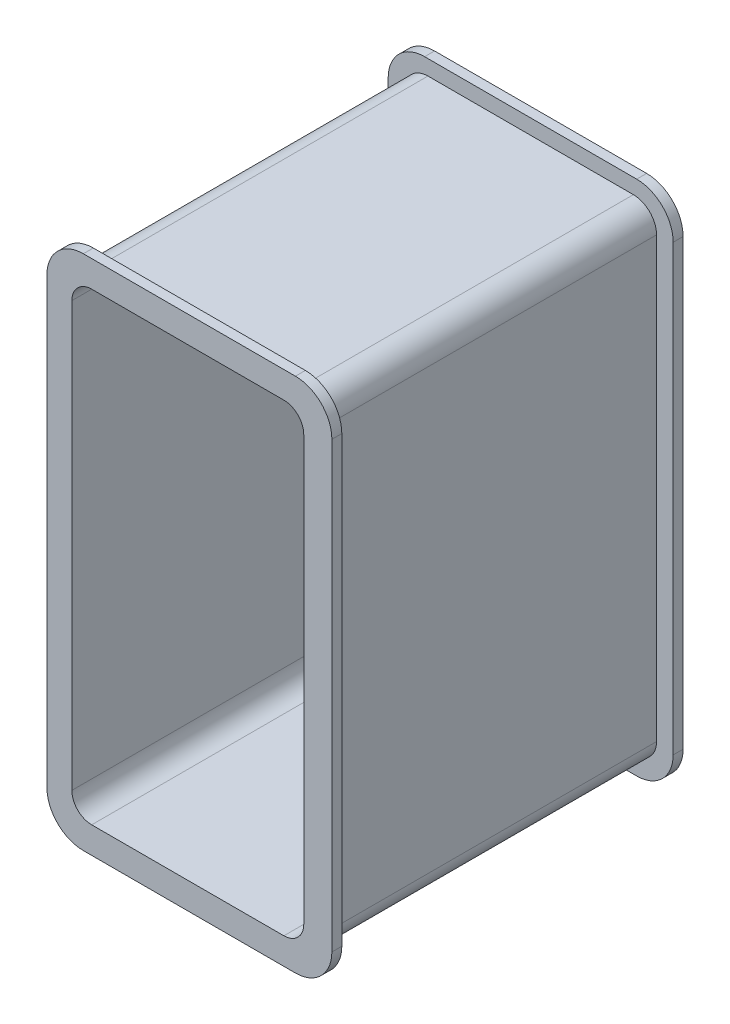
ISO-10303-21;
HEADER;
FILE_DESCRIPTION(('STEP AP214'),'2;1');
FILE_NAME('part.step','',(''),(''),'','','');
FILE_SCHEMA(('AUTOMOTIVE_DESIGN { 1 0 10303 214 1 1 1 1 }'));
ENDSEC;
DATA;
#1=APPLICATION_CONTEXT('core data for automotive mechanical design processes');
#2=APPLICATION_PROTOCOL_DEFINITION('international standard','automotive_design',2000,#1);
#3=PRODUCT_CONTEXT('',#1,'mechanical');
#4=PRODUCT('Part','Part','',(#3));
#5=PRODUCT_RELATED_PRODUCT_CATEGORY('part','',(#4));
#6=PRODUCT_DEFINITION_FORMATION('','',#4);
#7=PRODUCT_DEFINITION_CONTEXT('part definition',#1,'design');
#8=PRODUCT_DEFINITION('design','',#6,#7);
#9=PRODUCT_DEFINITION_SHAPE('','',#8);
#10=(LENGTH_UNIT() NAMED_UNIT(*) SI_UNIT(.MILLI.,.METRE.));
#11=(NAMED_UNIT(*) PLANE_ANGLE_UNIT() SI_UNIT($,.RADIAN.));
#12=(NAMED_UNIT(*) SI_UNIT($,.STERADIAN.) SOLID_ANGLE_UNIT());
#13=UNCERTAINTY_MEASURE_WITH_UNIT(LENGTH_MEASURE(1.E-05),#10,'distance_accuracy_value','');
#14=(GEOMETRIC_REPRESENTATION_CONTEXT(3) GLOBAL_UNCERTAINTY_ASSIGNED_CONTEXT((#13)) GLOBAL_UNIT_ASSIGNED_CONTEXT((#10,
#11,#12)) REPRESENTATION_CONTEXT('',''));
#15=CARTESIAN_POINT('',(0.,0.,0.));
#16=DIRECTION('',(0.,0.,1.));
#17=DIRECTION('',(1.,0.,0.));
#18=AXIS2_PLACEMENT_3D('',#15,#16,#17);
#19=CARTESIAN_POINT('',(-69.,7.,100.));
#20=DIRECTION('',(0.,0.,-1.));
#21=DIRECTION('',(-1.,0.,0.));
#22=AXIS2_PLACEMENT_3D('',#19,#20,#21);
#23=CYLINDRICAL_SURFACE('',#22,7.);
#24=CARTESIAN_POINT('',(-69.,7.,0.));
#25=DIRECTION('',(0.,0.,1.));
#26=DIRECTION('',(1.,0.,0.));
#27=AXIS2_PLACEMENT_3D('',#24,#25,#26);
#28=CIRCLE('',#27,7.);
#29=CARTESIAN_POINT('',(-76.,7.00000000000005,0.));
#30=VERTEX_POINT('',#29);
#31=CARTESIAN_POINT('',(-68.9999999999999,0.,0.));
#32=VERTEX_POINT('',#31);
#33=EDGE_CURVE('E553',#30,#32,#28,.T.);
#34=ORIENTED_EDGE('',*,*,#33,.T.);
#35=DIRECTION('',(0.,0.,-1.));
#36=VECTOR('',#35,1.);
#37=CARTESIAN_POINT('',(-68.9999999999999,0.,100.));
#38=LINE('',#37,#36);
#39=CARTESIAN_POINT('',(-68.9999999999999,0.,100.));
#40=VERTEX_POINT('',#39);
#41=EDGE_CURVE('E12',#40,#32,#38,.T.);
#42=ORIENTED_EDGE('',*,*,#41,.F.);
#43=CARTESIAN_POINT('',(-69.,7.,100.));
#44=DIRECTION('',(0.,0.,1.));
#45=DIRECTION('',(1.,0.,0.));
#46=AXIS2_PLACEMENT_3D('',#43,#44,#45);
#47=CIRCLE('',#46,7.);
#48=CARTESIAN_POINT('',(-76.,7.00000000000005,100.));
#49=VERTEX_POINT('',#48);
#50=EDGE_CURVE('E571',#49,#40,#47,.T.);
#51=ORIENTED_EDGE('',*,*,#50,.F.);
#52=DIRECTION('',(0.,0.,-1.));
#53=VECTOR('',#52,1.);
#54=CARTESIAN_POINT('',(-76.,7.00000000000005,100.));
#55=LINE('',#54,#53);
#56=EDGE_CURVE('E609',#49,#30,#55,.T.);
#57=ORIENTED_EDGE('',*,*,#56,.T.);
#58=EDGE_LOOP('',(#34,#42,#51,#57));
#59=FACE_BOUND('',#58,.T.);
#60=ADVANCED_FACE('F96',(#59),#23,.T.);
#61=CARTESIAN_POINT('',(-68.9999999999999,0.,100.));
#62=DIRECTION('',(0.,1.,0.));
#63=DIRECTION('',(0.,0.,1.));
#64=AXIS2_PLACEMENT_3D('',#61,#62,#63);
#65=PLANE('',#64);
#66=DIRECTION('',(1.,0.,0.));
#67=VECTOR('',#66,1.);
#68=CARTESIAN_POINT('',(-68.9999999999999,0.,0.));
#69=LINE('',#68,#67);
#70=CARTESIAN_POINT('',(-7.00000000000005,0.,0.));
#71=VERTEX_POINT('',#70);
#72=EDGE_CURVE('E614',#32,#71,#69,.T.);
#73=ORIENTED_EDGE('',*,*,#72,.T.);
#74=DIRECTION('',(0.,0.,-1.));
#75=VECTOR('',#74,1.);
#76=CARTESIAN_POINT('',(-7.00000000000005,0.,100.));
#77=LINE('',#76,#75);
#78=CARTESIAN_POINT('',(-7.00000000000005,0.,100.));
#79=VERTEX_POINT('',#78);
#80=EDGE_CURVE('E104',#79,#71,#77,.T.);
#81=ORIENTED_EDGE('',*,*,#80,.F.);
#82=DIRECTION('',(1.,0.,0.));
#83=VECTOR('',#82,1.);
#84=CARTESIAN_POINT('',(-68.9999999999999,0.,100.));
#85=LINE('',#84,#83);
#86=EDGE_CURVE('E576',#40,#79,#85,.T.);
#87=ORIENTED_EDGE('',*,*,#86,.F.);
#88=ORIENTED_EDGE('',*,*,#41,.T.);
#89=EDGE_LOOP('',(#73,#81,#87,#88));
#90=FACE_BOUND('',#89,.T.);
#91=ADVANCED_FACE('F663',(#90),#65,.F.);
#92=CARTESIAN_POINT('',(-7.,7.,100.));
#93=DIRECTION('',(0.,0.,-1.));
#94=DIRECTION('',(-1.,0.,0.));
#95=AXIS2_PLACEMENT_3D('',#92,#93,#94);
#96=CYLINDRICAL_SURFACE('',#95,7.);
#97=CARTESIAN_POINT('',(-7.,7.,0.));
#98=DIRECTION('',(0.,0.,-1.));
#99=DIRECTION('',(-1.,0.,0.));
#100=AXIS2_PLACEMENT_3D('',#97,#98,#99);
#101=CIRCLE('',#100,7.);
#102=CARTESIAN_POINT('',(0.,7.00000000000005,0.));
#103=VERTEX_POINT('',#102);
#104=EDGE_CURVE('E617',#103,#71,#101,.T.);
#105=ORIENTED_EDGE('',*,*,#104,.F.);
#106=DIRECTION('',(0.,0.,-1.));
#107=VECTOR('',#106,1.);
#108=CARTESIAN_POINT('',(0.,7.00000000000005,100.));
#109=LINE('',#108,#107);
#110=CARTESIAN_POINT('',(0.,7.00000000000005,100.));
#111=VERTEX_POINT('',#110);
#112=EDGE_CURVE('E654',#111,#103,#109,.T.);
#113=ORIENTED_EDGE('',*,*,#112,.F.);
#114=CARTESIAN_POINT('',(-7.,7.,100.));
#115=DIRECTION('',(0.,0.,-1.));
#116=DIRECTION('',(-1.,0.,0.));
#117=AXIS2_PLACEMENT_3D('',#114,#115,#116);
#118=CIRCLE('',#117,7.);
#119=EDGE_CURVE('E585',#111,#79,#118,.T.);
#120=ORIENTED_EDGE('',*,*,#119,.T.);
#121=ORIENTED_EDGE('',*,*,#80,.T.);
#122=EDGE_LOOP('',(#105,#113,#120,#121));
#123=FACE_BOUND('',#122,.T.);
#124=ADVANCED_FACE('F665',(#123),#96,.T.);
#125=CARTESIAN_POINT('',(0.,7.00000000000005,100.));
#126=DIRECTION('',(-1.,0.,0.));
#127=DIRECTION('',(0.,0.,1.));
#128=AXIS2_PLACEMENT_3D('',#125,#126,#127);
#129=PLANE('',#128);
#130=DIRECTION('',(0.,1.,0.));
#131=VECTOR('',#130,1.);
#132=CARTESIAN_POINT('',(0.,7.00000000000005,0.));
#133=LINE('',#132,#131);
#134=CARTESIAN_POINT('',(0.,139.44146134403,0.));
#135=VERTEX_POINT('',#134);
#136=EDGE_CURVE('E618',#103,#135,#133,.T.);
#137=ORIENTED_EDGE('',*,*,#136,.T.);
#138=DIRECTION('',(0.,0.,-1.));
#139=VECTOR('',#138,1.);
#140=CARTESIAN_POINT('',(0.,139.44146134403,100.));
#141=LINE('',#140,#139);
#142=CARTESIAN_POINT('',(0.,139.44146134403,100.));
#143=VERTEX_POINT('',#142);
#144=EDGE_CURVE('E651',#143,#135,#141,.T.);
#145=ORIENTED_EDGE('',*,*,#144,.F.);
#146=DIRECTION('',(0.,1.,0.));
#147=VECTOR('',#146,1.);
#148=CARTESIAN_POINT('',(0.,7.00000000000005,100.));
#149=LINE('',#148,#147);
#150=EDGE_CURVE('E586',#111,#143,#149,.T.);
#151=ORIENTED_EDGE('',*,*,#150,.F.);
#152=ORIENTED_EDGE('',*,*,#112,.T.);
#153=EDGE_LOOP('',(#137,#145,#151,#152));
#154=FACE_BOUND('',#153,.T.);
#155=ADVANCED_FACE('F674',(#154),#129,.F.);
#156=CARTESIAN_POINT('',(-7.,139.44146134403,100.));
#157=DIRECTION('',(0.,0.,-1.));
#158=DIRECTION('',(-1.,0.,0.));
#159=AXIS2_PLACEMENT_3D('',#156,#157,#158);
#160=CYLINDRICAL_SURFACE('',#159,7.);
#161=CARTESIAN_POINT('',(-7.,139.44146134403,0.));
#162=DIRECTION('',(0.,0.,1.));
#163=DIRECTION('',(1.,0.,0.));
#164=AXIS2_PLACEMENT_3D('',#161,#162,#163);
#165=CIRCLE('',#164,7.);
#166=CARTESIAN_POINT('',(-7.,146.44146134403,0.));
#167=VERTEX_POINT('',#166);
#168=EDGE_CURVE('E624',#135,#167,#165,.T.);
#169=ORIENTED_EDGE('',*,*,#168,.T.);
#170=DIRECTION('',(0.,0.,-1.));
#171=VECTOR('',#170,1.);
#172=CARTESIAN_POINT('',(-7.,146.44146134403,100.));
#173=LINE('',#172,#171);
#174=CARTESIAN_POINT('',(-7.,146.44146134403,100.));
#175=VERTEX_POINT('',#174);
#176=EDGE_CURVE('E650',#175,#167,#173,.T.);
#177=ORIENTED_EDGE('',*,*,#176,.F.);
#178=CARTESIAN_POINT('',(-7.,139.44146134403,100.));
#179=DIRECTION('',(0.,0.,1.));
#180=DIRECTION('',(1.,0.,0.));
#181=AXIS2_PLACEMENT_3D('',#178,#179,#180);
#182=CIRCLE('',#181,7.);
#183=EDGE_CURVE('E595',#143,#175,#182,.T.);
#184=ORIENTED_EDGE('',*,*,#183,.F.);
#185=ORIENTED_EDGE('',*,*,#144,.T.);
#186=EDGE_LOOP('',(#169,#177,#184,#185));
#187=FACE_BOUND('',#186,.T.);
#188=ADVANCED_FACE('F681',(#187),#160,.T.);
#189=CARTESIAN_POINT('',(-7.,146.44146134403,100.));
#190=DIRECTION('',(0.,-1.,0.));
#191=DIRECTION('',(0.,0.,-1.));
#192=AXIS2_PLACEMENT_3D('',#189,#190,#191);
#193=PLANE('',#192);
#194=DIRECTION('',(-1.,0.,0.));
#195=VECTOR('',#194,1.);
#196=CARTESIAN_POINT('',(-7.,146.44146134403,0.));
#197=LINE('',#196,#195);
#198=CARTESIAN_POINT('',(-69.,146.44146134403,0.));
#199=VERTEX_POINT('',#198);
#200=EDGE_CURVE('E627',#167,#199,#197,.T.);
#201=ORIENTED_EDGE('',*,*,#200,.T.);
#202=DIRECTION('',(0.,0.,-1.));
#203=VECTOR('',#202,1.);
#204=CARTESIAN_POINT('',(-69.,146.44146134403,100.));
#205=LINE('',#204,#203);
#206=CARTESIAN_POINT('',(-69.,146.44146134403,100.));
#207=VERTEX_POINT('',#206);
#208=EDGE_CURVE('E641',#207,#199,#205,.T.);
#209=ORIENTED_EDGE('',*,*,#208,.F.);
#210=DIRECTION('',(-1.,0.,0.));
#211=VECTOR('',#210,1.);
#212=CARTESIAN_POINT('',(-7.,146.44146134403,100.));
#213=LINE('',#212,#211);
#214=EDGE_CURVE('E596',#175,#207,#213,.T.);
#215=ORIENTED_EDGE('',*,*,#214,.F.);
#216=ORIENTED_EDGE('',*,*,#176,.T.);
#217=EDGE_LOOP('',(#201,#209,#215,#216));
#218=FACE_BOUND('',#217,.T.);
#219=ADVANCED_FACE('F682',(#218),#193,.F.);
#220=CARTESIAN_POINT('',(-69.,139.44146134403,100.));
#221=DIRECTION('',(0.,0.,-1.));
#222=DIRECTION('',(-1.,0.,0.));
#223=AXIS2_PLACEMENT_3D('',#220,#221,#222);
#224=CYLINDRICAL_SURFACE('',#223,7.);
#225=CARTESIAN_POINT('',(-69.,139.44146134403,0.));
#226=DIRECTION('',(0.,0.,1.));
#227=DIRECTION('',(1.,0.,0.));
#228=AXIS2_PLACEMENT_3D('',#225,#226,#227);
#229=CIRCLE('',#228,7.);
#230=CARTESIAN_POINT('',(-76.,139.44146134403,0.));
#231=VERTEX_POINT('',#230);
#232=EDGE_CURVE('E634',#199,#231,#229,.T.);
#233=ORIENTED_EDGE('',*,*,#232,.T.);
#234=DIRECTION('',(0.,0.,-1.));
#235=VECTOR('',#234,1.);
#236=CARTESIAN_POINT('',(-76.,139.44146134403,100.));
#237=LINE('',#236,#235);
#238=CARTESIAN_POINT('',(-76.,139.44146134403,100.));
#239=VERTEX_POINT('',#238);
#240=EDGE_CURVE('E115',#239,#231,#237,.T.);
#241=ORIENTED_EDGE('',*,*,#240,.F.);
#242=CARTESIAN_POINT('',(-69.,139.44146134403,100.));
#243=DIRECTION('',(0.,0.,1.));
#244=DIRECTION('',(1.,0.,0.));
#245=AXIS2_PLACEMENT_3D('',#242,#243,#244);
#246=CIRCLE('',#245,7.);
#247=EDGE_CURVE('E599',#207,#239,#246,.T.);
#248=ORIENTED_EDGE('',*,*,#247,.F.);
#249=ORIENTED_EDGE('',*,*,#208,.T.);
#250=EDGE_LOOP('',(#233,#241,#248,#249));
#251=FACE_BOUND('',#250,.T.);
#252=ADVANCED_FACE('F683',(#251),#224,.T.);
#253=CARTESIAN_POINT('',(-76.,139.44146134403,100.));
#254=DIRECTION('',(1.,0.,0.));
#255=DIRECTION('',(0.,0.,-1.));
#256=AXIS2_PLACEMENT_3D('',#253,#254,#255);
#257=PLANE('',#256);
#258=DIRECTION('',(0.,-1.,0.));
#259=VECTOR('',#258,1.);
#260=CARTESIAN_POINT('',(-76.,139.44146134403,0.));
#261=LINE('',#260,#259);
#262=EDGE_CURVE('E578',#231,#30,#261,.T.);
#263=ORIENTED_EDGE('',*,*,#262,.T.);
#264=ORIENTED_EDGE('',*,*,#56,.F.);
#265=DIRECTION('',(0.,-1.,0.));
#266=VECTOR('',#265,1.);
#267=CARTESIAN_POINT('',(-76.,139.44146134403,100.));
#268=LINE('',#267,#266);
#269=EDGE_CURVE('E603',#239,#49,#268,.T.);
#270=ORIENTED_EDGE('',*,*,#269,.F.);
#271=ORIENTED_EDGE('',*,*,#240,.T.);
#272=EDGE_LOOP('',(#263,#264,#270,#271));
#273=FACE_BOUND('',#272,.T.);
#274=ADVANCED_FACE('F679',(#273),#257,.F.);
#275=CARTESIAN_POINT('',(-70.,6.,0.));
#276=DIRECTION('',(0.,0.,-1.));
#277=DIRECTION('',(-1.,0.,0.));
#278=AXIS2_PLACEMENT_3D('',#275,#276,#277);
#279=PLANE('',#278);
#280=ORIENTED_EDGE('',*,*,#33,.F.);
#281=ORIENTED_EDGE('',*,*,#262,.F.);
#282=ORIENTED_EDGE('',*,*,#232,.F.);
#283=ORIENTED_EDGE('',*,*,#200,.F.);
#284=ORIENTED_EDGE('',*,*,#168,.F.);
#285=ORIENTED_EDGE('',*,*,#136,.F.);
#286=ORIENTED_EDGE('',*,*,#104,.T.);
#287=ORIENTED_EDGE('',*,*,#72,.F.);
#288=EDGE_LOOP('',(#280,#281,#282,#283,#284,#285,#286,#287));
#289=FACE_BOUND('',#288,.T.);
#290=DIRECTION('',(-1.,0.,0.));
#291=VECTOR('',#290,1.);
#292=CARTESIAN_POINT('',(-6.00000000000008,-5.,0.));
#293=LINE('',#292,#291);
#294=CARTESIAN_POINT('',(-6.00000000000007,-5.,0.));
#295=VERTEX_POINT('',#294);
#296=CARTESIAN_POINT('',(-69.9999999999999,-4.99999999999999,0.));
#297=VERTEX_POINT('',#296);
#298=EDGE_CURVE('E436',#295,#297,#293,.T.);
#299=ORIENTED_EDGE('',*,*,#298,.F.);
#300=CARTESIAN_POINT('',(-6.,6.,0.));
#301=DIRECTION('',(0.,0.,-1.));
#302=DIRECTION('',(-1.,0.,0.));
#303=AXIS2_PLACEMENT_3D('',#300,#301,#302);
#304=CIRCLE('',#303,11.);
#305=CARTESIAN_POINT('',(5.,6.00000000000008,0.));
#306=VERTEX_POINT('',#305);
#307=EDGE_CURVE('E445',#306,#295,#304,.T.);
#308=ORIENTED_EDGE('',*,*,#307,.F.);
#309=DIRECTION('',(0.,-1.,0.));
#310=VECTOR('',#309,1.);
#311=CARTESIAN_POINT('',(5.,140.,0.));
#312=LINE('',#311,#310);
#313=CARTESIAN_POINT('',(5.00000000000001,140.,0.));
#314=VERTEX_POINT('',#313);
#315=EDGE_CURVE('E490',#314,#306,#312,.T.);
#316=ORIENTED_EDGE('',*,*,#315,.F.);
#317=CARTESIAN_POINT('',(-6.,140.,0.));
#318=DIRECTION('',(0.,0.,1.));
#319=DIRECTION('',(1.,0.,0.));
#320=AXIS2_PLACEMENT_3D('',#317,#318,#319);
#321=CIRCLE('',#320,11.);
#322=CARTESIAN_POINT('',(-6.00000000000008,151.,0.));
#323=VERTEX_POINT('',#322);
#324=EDGE_CURVE('E483',#314,#323,#321,.T.);
#325=ORIENTED_EDGE('',*,*,#324,.T.);
#326=DIRECTION('',(1.,0.,0.));
#327=VECTOR('',#326,1.);
#328=CARTESIAN_POINT('',(-38.,151.,0.));
#329=LINE('',#328,#327);
#330=CARTESIAN_POINT('',(-69.9999999999999,151.,0.));
#331=VERTEX_POINT('',#330);
#332=EDGE_CURVE('E479',#331,#323,#329,.T.);
#333=ORIENTED_EDGE('',*,*,#332,.F.);
#334=CARTESIAN_POINT('',(-70.,140.,0.));
#335=DIRECTION('',(0.,0.,-1.));
#336=DIRECTION('',(-1.,0.,0.));
#337=AXIS2_PLACEMENT_3D('',#334,#335,#336);
#338=CIRCLE('',#337,11.);
#339=CARTESIAN_POINT('',(-81.,140.,0.));
#340=VERTEX_POINT('',#339);
#341=EDGE_CURVE('E474',#340,#331,#338,.T.);
#342=ORIENTED_EDGE('',*,*,#341,.F.);
#343=DIRECTION('',(0.,1.,0.));
#344=VECTOR('',#343,1.);
#345=CARTESIAN_POINT('',(-81.,73.2207306720151,0.));
#346=LINE('',#345,#344);
#347=CARTESIAN_POINT('',(-81.,6.,0.));
#348=VERTEX_POINT('',#347);
#349=EDGE_CURVE('E472',#348,#340,#346,.T.);
#350=ORIENTED_EDGE('',*,*,#349,.F.);
#351=CARTESIAN_POINT('',(-70.,6.,0.));
#352=DIRECTION('',(0.,0.,-1.));
#353=DIRECTION('',(-1.,0.,0.));
#354=AXIS2_PLACEMENT_3D('',#351,#352,#353);
#355=CIRCLE('',#354,11.);
#356=EDGE_CURVE('E470',#297,#348,#355,.T.);
#357=ORIENTED_EDGE('',*,*,#356,.F.);
#358=EDGE_LOOP('',(#299,#308,#316,#325,#333,#342,#350,#357));
#359=FACE_BOUND('',#358,.T.);
#360=ADVANCED_FACE('F667',(#289,#359),#279,.F.);
#361=CARTESIAN_POINT('',(-70.,6.,-3.));
#362=DIRECTION('',(0.,0.,-1.));
#363=DIRECTION('',(-1.,0.,0.));
#364=AXIS2_PLACEMENT_3D('',#361,#362,#363);
#365=PLANE('',#364);
#366=DIRECTION('',(-1.,0.,0.));
#367=VECTOR('',#366,1.);
#368=CARTESIAN_POINT('',(-6.00000000000008,-5.,-3.));
#369=LINE('',#368,#367);
#370=CARTESIAN_POINT('',(-6.00000000000007,-5.,-3.));
#371=VERTEX_POINT('',#370);
#372=CARTESIAN_POINT('',(-69.9999999999999,-4.99999999999999,-3.));
#373=VERTEX_POINT('',#372);
#374=EDGE_CURVE('E440',#371,#373,#369,.T.);
#375=ORIENTED_EDGE('',*,*,#374,.T.);
#376=CARTESIAN_POINT('',(-70.,6.,-3.));
#377=DIRECTION('',(0.,0.,-1.));
#378=DIRECTION('',(-1.,0.,0.));
#379=AXIS2_PLACEMENT_3D('',#376,#377,#378);
#380=CIRCLE('',#379,11.);
#381=CARTESIAN_POINT('',(-81.,6.,-3.));
#382=VERTEX_POINT('',#381);
#383=EDGE_CURVE('E442',#373,#382,#380,.T.);
#384=ORIENTED_EDGE('',*,*,#383,.T.);
#385=DIRECTION('',(0.,1.,0.));
#386=VECTOR('',#385,1.);
#387=CARTESIAN_POINT('',(-81.,6.00000000000008,-3.));
#388=LINE('',#387,#386);
#389=CARTESIAN_POINT('',(-81.,140.,-3.));
#390=VERTEX_POINT('',#389);
#391=EDGE_CURVE('E443',#382,#390,#388,.T.);
#392=ORIENTED_EDGE('',*,*,#391,.T.);
#393=CARTESIAN_POINT('',(-70.,140.,-3.));
#394=DIRECTION('',(0.,0.,-1.));
#395=DIRECTION('',(-1.,0.,0.));
#396=AXIS2_PLACEMENT_3D('',#393,#394,#395);
#397=CIRCLE('',#396,11.);
#398=CARTESIAN_POINT('',(-69.9999999999999,151.,-3.));
#399=VERTEX_POINT('',#398);
#400=EDGE_CURVE('E447',#390,#399,#397,.T.);
#401=ORIENTED_EDGE('',*,*,#400,.T.);
#402=DIRECTION('',(1.,0.,0.));
#403=VECTOR('',#402,1.);
#404=CARTESIAN_POINT('',(-69.9999999999999,151.,-3.));
#405=LINE('',#404,#403);
#406=CARTESIAN_POINT('',(-6.00000000000008,151.,-3.));
#407=VERTEX_POINT('',#406);
#408=EDGE_CURVE('E452',#399,#407,#405,.T.);
#409=ORIENTED_EDGE('',*,*,#408,.T.);
#410=CARTESIAN_POINT('',(-6.,140.,-3.));
#411=DIRECTION('',(0.,0.,1.));
#412=DIRECTION('',(1.,0.,0.));
#413=AXIS2_PLACEMENT_3D('',#410,#411,#412);
#414=CIRCLE('',#413,11.);
#415=CARTESIAN_POINT('',(5.00000000000001,140.,-3.));
#416=VERTEX_POINT('',#415);
#417=EDGE_CURVE('E451',#416,#407,#414,.T.);
#418=ORIENTED_EDGE('',*,*,#417,.F.);
#419=DIRECTION('',(0.,-1.,0.));
#420=VECTOR('',#419,1.);
#421=CARTESIAN_POINT('',(5.,140.,-3.));
#422=LINE('',#421,#420);
#423=CARTESIAN_POINT('',(5.,6.00000000000008,-3.));
#424=VERTEX_POINT('',#423);
#425=EDGE_CURVE('E456',#416,#424,#422,.T.);
#426=ORIENTED_EDGE('',*,*,#425,.T.);
#427=CARTESIAN_POINT('',(-6.,6.,-3.));
#428=DIRECTION('',(0.,0.,-1.));
#429=DIRECTION('',(-1.,0.,0.));
#430=AXIS2_PLACEMENT_3D('',#427,#428,#429);
#431=CIRCLE('',#430,11.);
#432=EDGE_CURVE('E463',#424,#371,#431,.T.);
#433=ORIENTED_EDGE('',*,*,#432,.T.);
#434=EDGE_LOOP('',(#375,#384,#392,#401,#409,#418,#426,#433));
#435=FACE_BOUND('',#434,.T.);
#436=ADVANCED_FACE('F844',(#435),#365,.T.);
#437=CARTESIAN_POINT('',(-6.,6.,-3.));
#438=DIRECTION('',(0.,0.,1.));
#439=DIRECTION('',(1.,0.,0.));
#440=AXIS2_PLACEMENT_3D('',#437,#438,#439);
#441=CYLINDRICAL_SURFACE('',#440,11.);
#442=ORIENTED_EDGE('',*,*,#307,.T.);
#443=DIRECTION('',(0.,0.,1.));
#444=VECTOR('',#443,1.);
#445=CARTESIAN_POINT('',(-6.00000000000007,-5.,-3.));
#446=LINE('',#445,#444);
#447=EDGE_CURVE('E465',#371,#295,#446,.T.);
#448=ORIENTED_EDGE('',*,*,#447,.F.);
#449=ORIENTED_EDGE('',*,*,#432,.F.);
#450=DIRECTION('',(0.,0.,1.));
#451=VECTOR('',#450,1.);
#452=CARTESIAN_POINT('',(5.,6.00000000000008,-3.));
#453=LINE('',#452,#451);
#454=EDGE_CURVE('E494',#424,#306,#453,.T.);
#455=ORIENTED_EDGE('',*,*,#454,.T.);
#456=EDGE_LOOP('',(#442,#448,#449,#455));
#457=FACE_BOUND('',#456,.T.);
#458=ADVANCED_FACE('F855',(#457),#441,.T.);
#459=CARTESIAN_POINT('',(5.,140.,-3.));
#460=DIRECTION('',(-1.,0.,0.));
#461=DIRECTION('',(0.,0.,1.));
#462=AXIS2_PLACEMENT_3D('',#459,#460,#461);
#463=PLANE('',#462);
#464=ORIENTED_EDGE('',*,*,#315,.T.);
#465=ORIENTED_EDGE('',*,*,#454,.F.);
#466=ORIENTED_EDGE('',*,*,#425,.F.);
#467=DIRECTION('',(0.,0.,1.));
#468=VECTOR('',#467,1.);
#469=CARTESIAN_POINT('',(5.00000000000001,140.,-3.));
#470=LINE('',#469,#468);
#471=EDGE_CURVE('E496',#416,#314,#470,.T.);
#472=ORIENTED_EDGE('',*,*,#471,.T.);
#473=EDGE_LOOP('',(#464,#465,#466,#472));
#474=FACE_BOUND('',#473,.T.);
#475=ADVANCED_FACE('F861',(#474),#463,.F.);
#476=CARTESIAN_POINT('',(-6.,140.,-3.));
#477=DIRECTION('',(0.,0.,1.));
#478=DIRECTION('',(1.,0.,0.));
#479=AXIS2_PLACEMENT_3D('',#476,#477,#478);
#480=CYLINDRICAL_SURFACE('',#479,11.);
#481=ORIENTED_EDGE('',*,*,#324,.F.);
#482=ORIENTED_EDGE('',*,*,#471,.F.);
#483=ORIENTED_EDGE('',*,*,#417,.T.);
#484=DIRECTION('',(0.,0.,1.));
#485=VECTOR('',#484,1.);
#486=CARTESIAN_POINT('',(-6.00000000000008,151.,-3.));
#487=LINE('',#486,#485);
#488=EDGE_CURVE('E504',#407,#323,#487,.T.);
#489=ORIENTED_EDGE('',*,*,#488,.T.);
#490=EDGE_LOOP('',(#481,#482,#483,#489));
#491=FACE_BOUND('',#490,.T.);
#492=ADVANCED_FACE('F873',(#491),#480,.T.);
#493=CARTESIAN_POINT('',(-38.,151.,-3.));
#494=DIRECTION('',(0.,-1.,0.));
#495=DIRECTION('',(0.,0.,-1.));
#496=AXIS2_PLACEMENT_3D('',#493,#494,#495);
#497=PLANE('',#496);
#498=ORIENTED_EDGE('',*,*,#332,.T.);
#499=ORIENTED_EDGE('',*,*,#488,.F.);
#500=ORIENTED_EDGE('',*,*,#408,.F.);
#501=DIRECTION('',(0.,0.,1.));
#502=VECTOR('',#501,1.);
#503=CARTESIAN_POINT('',(-69.9999999999999,151.,-3.));
#504=LINE('',#503,#502);
#505=EDGE_CURVE('E501',#399,#331,#504,.T.);
#506=ORIENTED_EDGE('',*,*,#505,.T.);
#507=EDGE_LOOP('',(#498,#499,#500,#506));
#508=FACE_BOUND('',#507,.T.);
#509=ADVANCED_FACE('F884',(#508),#497,.F.);
#510=CARTESIAN_POINT('',(-70.,140.,-3.));
#511=DIRECTION('',(0.,0.,1.));
#512=DIRECTION('',(1.,0.,0.));
#513=AXIS2_PLACEMENT_3D('',#510,#511,#512);
#514=CYLINDRICAL_SURFACE('',#513,11.);
#515=ORIENTED_EDGE('',*,*,#341,.T.);
#516=ORIENTED_EDGE('',*,*,#505,.F.);
#517=ORIENTED_EDGE('',*,*,#400,.F.);
#518=DIRECTION('',(0.,0.,1.));
#519=VECTOR('',#518,1.);
#520=CARTESIAN_POINT('',(-81.,140.,-3.));
#521=LINE('',#520,#519);
#522=EDGE_CURVE('E506',#390,#340,#521,.T.);
#523=ORIENTED_EDGE('',*,*,#522,.T.);
#524=EDGE_LOOP('',(#515,#516,#517,#523));
#525=FACE_BOUND('',#524,.T.);
#526=ADVANCED_FACE('F895',(#525),#514,.T.);
#527=CARTESIAN_POINT('',(-81.,73.2207306720151,-3.));
#528=DIRECTION('',(1.,0.,0.));
#529=DIRECTION('',(0.,0.,-1.));
#530=AXIS2_PLACEMENT_3D('',#527,#528,#529);
#531=PLANE('',#530);
#532=ORIENTED_EDGE('',*,*,#349,.T.);
#533=ORIENTED_EDGE('',*,*,#522,.F.);
#534=ORIENTED_EDGE('',*,*,#391,.F.);
#535=DIRECTION('',(0.,0.,1.));
#536=VECTOR('',#535,1.);
#537=CARTESIAN_POINT('',(-81.,6.,-3.));
#538=LINE('',#537,#536);
#539=EDGE_CURVE('E511',#382,#348,#538,.T.);
#540=ORIENTED_EDGE('',*,*,#539,.T.);
#541=EDGE_LOOP('',(#532,#533,#534,#540));
#542=FACE_BOUND('',#541,.T.);
#543=ADVANCED_FACE('F907',(#542),#531,.F.);
#544=CARTESIAN_POINT('',(-70.,6.,-3.));
#545=DIRECTION('',(0.,0.,1.));
#546=DIRECTION('',(1.,0.,0.));
#547=AXIS2_PLACEMENT_3D('',#544,#545,#546);
#548=CYLINDRICAL_SURFACE('',#547,11.);
#549=ORIENTED_EDGE('',*,*,#356,.T.);
#550=ORIENTED_EDGE('',*,*,#539,.F.);
#551=ORIENTED_EDGE('',*,*,#383,.F.);
#552=DIRECTION('',(0.,0.,1.));
#553=VECTOR('',#552,1.);
#554=CARTESIAN_POINT('',(-69.9999999999999,-4.99999999999999,-3.));
#555=LINE('',#554,#553);
#556=EDGE_CURVE('E519',#373,#297,#555,.T.);
#557=ORIENTED_EDGE('',*,*,#556,.T.);
#558=EDGE_LOOP('',(#549,#550,#551,#557));
#559=FACE_BOUND('',#558,.T.);
#560=ADVANCED_FACE('F918',(#559),#548,.T.);
#561=CARTESIAN_POINT('',(-6.00000000000008,-5.,-3.));
#562=DIRECTION('',(0.,1.,0.));
#563=DIRECTION('',(0.,0.,1.));
#564=AXIS2_PLACEMENT_3D('',#561,#562,#563);
#565=PLANE('',#564);
#566=ORIENTED_EDGE('',*,*,#298,.T.);
#567=ORIENTED_EDGE('',*,*,#556,.F.);
#568=ORIENTED_EDGE('',*,*,#374,.F.);
#569=ORIENTED_EDGE('',*,*,#447,.T.);
#570=EDGE_LOOP('',(#566,#567,#568,#569));
#571=FACE_BOUND('',#570,.T.);
#572=ADVANCED_FACE('F927',(#571),#565,.F.);
#573=CARTESIAN_POINT('',(-70.,140.,100.));
#574=DIRECTION('',(0.,0.,1.));
#575=DIRECTION('',(1.,0.,0.));
#576=AXIS2_PLACEMENT_3D('',#573,#574,#575);
#577=PLANE('',#576);
#578=CARTESIAN_POINT('',(-70.,140.,100.));
#579=DIRECTION('',(0.,0.,1.));
#580=DIRECTION('',(1.,0.,0.));
#581=AXIS2_PLACEMENT_3D('',#578,#579,#580);
#582=CIRCLE('',#581,11.);
#583=CARTESIAN_POINT('',(-69.9999999999999,151.,100.));
#584=VERTEX_POINT('',#583);
#585=CARTESIAN_POINT('',(-81.,140.,100.));
#586=VERTEX_POINT('',#585);
#587=EDGE_CURVE('E355',#584,#586,#582,.T.);
#588=ORIENTED_EDGE('',*,*,#587,.F.);
#589=DIRECTION('',(-1.,0.,0.));
#590=VECTOR('',#589,1.);
#591=CARTESIAN_POINT('',(-69.9999999999999,151.,100.));
#592=LINE('',#591,#590);
#593=CARTESIAN_POINT('',(-6.00000000000007,151.,100.));
#594=VERTEX_POINT('',#593);
#595=EDGE_CURVE('E358',#594,#584,#592,.T.);
#596=ORIENTED_EDGE('',*,*,#595,.F.);
#597=CARTESIAN_POINT('',(-6.,140.,100.));
#598=DIRECTION('',(0.,0.,1.));
#599=DIRECTION('',(1.,0.,0.));
#600=AXIS2_PLACEMENT_3D('',#597,#598,#599);
#601=CIRCLE('',#600,11.);
#602=CARTESIAN_POINT('',(5.00000000000001,140.,100.));
#603=VERTEX_POINT('',#602);
#604=EDGE_CURVE('E398',#603,#594,#601,.T.);
#605=ORIENTED_EDGE('',*,*,#604,.F.);
#606=DIRECTION('',(0.,1.,0.));
#607=VECTOR('',#606,1.);
#608=CARTESIAN_POINT('',(5.,140.,100.));
#609=LINE('',#608,#607);
#610=CARTESIAN_POINT('',(5.,6.00000000000008,100.));
#611=VERTEX_POINT('',#610);
#612=EDGE_CURVE('E399',#611,#603,#609,.T.);
#613=ORIENTED_EDGE('',*,*,#612,.F.);
#614=CARTESIAN_POINT('',(-6.,6.,100.));
#615=DIRECTION('',(0.,0.,1.));
#616=DIRECTION('',(-1.,0.,0.));
#617=AXIS2_PLACEMENT_3D('',#614,#615,#616);
#618=CIRCLE('',#617,11.);
#619=CARTESIAN_POINT('',(-6.00000000000007,-5.,100.));
#620=VERTEX_POINT('',#619);
#621=EDGE_CURVE('E395',#620,#611,#618,.T.);
#622=ORIENTED_EDGE('',*,*,#621,.F.);
#623=DIRECTION('',(1.,0.,0.));
#624=VECTOR('',#623,1.);
#625=CARTESIAN_POINT('',(-6.00000000000008,-5.,100.));
#626=LINE('',#625,#624);
#627=CARTESIAN_POINT('',(-69.9999999999999,-5.,100.));
#628=VERTEX_POINT('',#627);
#629=EDGE_CURVE('E393',#628,#620,#626,.T.);
#630=ORIENTED_EDGE('',*,*,#629,.F.);
#631=CARTESIAN_POINT('',(-70.,6.,100.));
#632=DIRECTION('',(0.,0.,1.));
#633=DIRECTION('',(1.,0.,0.));
#634=AXIS2_PLACEMENT_3D('',#631,#632,#633);
#635=CIRCLE('',#634,11.);
#636=CARTESIAN_POINT('',(-81.,6.00000000000008,100.));
#637=VERTEX_POINT('',#636);
#638=EDGE_CURVE('E389',#637,#628,#635,.T.);
#639=ORIENTED_EDGE('',*,*,#638,.F.);
#640=DIRECTION('',(0.,-1.,0.));
#641=VECTOR('',#640,1.);
#642=CARTESIAN_POINT('',(-81.,6.00000000000008,100.));
#643=LINE('',#642,#641);
#644=EDGE_CURVE('E384',#586,#637,#643,.T.);
#645=ORIENTED_EDGE('',*,*,#644,.F.);
#646=EDGE_LOOP('',(#588,#596,#605,#613,#622,#630,#639,#645));
#647=FACE_BOUND('',#646,.T.);
#648=ORIENTED_EDGE('',*,*,#269,.T.);
#649=ORIENTED_EDGE('',*,*,#50,.T.);
#650=ORIENTED_EDGE('',*,*,#86,.T.);
#651=ORIENTED_EDGE('',*,*,#119,.F.);
#652=ORIENTED_EDGE('',*,*,#150,.T.);
#653=ORIENTED_EDGE('',*,*,#183,.T.);
#654=ORIENTED_EDGE('',*,*,#214,.T.);
#655=ORIENTED_EDGE('',*,*,#247,.T.);
#656=EDGE_LOOP('',(#648,#649,#650,#651,#652,#653,#654,#655));
#657=FACE_BOUND('',#656,.T.);
#658=ADVANCED_FACE('F673',(#647,#657),#577,.F.);
#659=CARTESIAN_POINT('',(-70.,140.,103.));
#660=DIRECTION('',(0.,0.,1.));
#661=DIRECTION('',(1.,0.,0.));
#662=AXIS2_PLACEMENT_3D('',#659,#660,#661);
#663=PLANE('',#662);
#664=CARTESIAN_POINT('',(-70.,140.,103.));
#665=DIRECTION('',(0.,0.,1.));
#666=DIRECTION('',(1.,0.,0.));
#667=AXIS2_PLACEMENT_3D('',#664,#665,#666);
#668=CIRCLE('',#667,11.);
#669=CARTESIAN_POINT('',(-69.9999999999999,151.,103.));
#670=VERTEX_POINT('',#669);
#671=CARTESIAN_POINT('',(-81.,140.,103.));
#672=VERTEX_POINT('',#671);
#673=EDGE_CURVE('E351',#670,#672,#668,.T.);
#674=ORIENTED_EDGE('',*,*,#673,.T.);
#675=DIRECTION('',(0.,-1.,0.));
#676=VECTOR('',#675,1.);
#677=CARTESIAN_POINT('',(-81.,6.00000000000008,103.));
#678=LINE('',#677,#676);
#679=CARTESIAN_POINT('',(-81.,6.00000000000008,103.));
#680=VERTEX_POINT('',#679);
#681=EDGE_CURVE('E356',#672,#680,#678,.T.);
#682=ORIENTED_EDGE('',*,*,#681,.T.);
#683=CARTESIAN_POINT('',(-70.,6.,103.));
#684=DIRECTION('',(0.,0.,1.));
#685=DIRECTION('',(1.,0.,0.));
#686=AXIS2_PLACEMENT_3D('',#683,#684,#685);
#687=CIRCLE('',#686,11.);
#688=CARTESIAN_POINT('',(-69.9999999999999,-5.,103.));
#689=VERTEX_POINT('',#688);
#690=EDGE_CURVE('E361',#680,#689,#687,.T.);
#691=ORIENTED_EDGE('',*,*,#690,.T.);
#692=DIRECTION('',(1.,0.,0.));
#693=VECTOR('',#692,1.);
#694=CARTESIAN_POINT('',(-6.00000000000008,-5.,103.));
#695=LINE('',#694,#693);
#696=CARTESIAN_POINT('',(-6.00000000000007,-5.,103.));
#697=VERTEX_POINT('',#696);
#698=EDGE_CURVE('E368',#689,#697,#695,.T.);
#699=ORIENTED_EDGE('',*,*,#698,.T.);
#700=CARTESIAN_POINT('',(-6.,6.,103.));
#701=DIRECTION('',(0.,0.,1.));
#702=DIRECTION('',(-1.,0.,0.));
#703=AXIS2_PLACEMENT_3D('',#700,#701,#702);
#704=CIRCLE('',#703,11.);
#705=CARTESIAN_POINT('',(5.,6.00000000000008,103.));
#706=VERTEX_POINT('',#705);
#707=EDGE_CURVE('E369',#697,#706,#704,.T.);
#708=ORIENTED_EDGE('',*,*,#707,.T.);
#709=DIRECTION('',(0.,1.,0.));
#710=VECTOR('',#709,1.);
#711=CARTESIAN_POINT('',(5.,140.,103.));
#712=LINE('',#711,#710);
#713=CARTESIAN_POINT('',(5.00000000000001,140.,103.));
#714=VERTEX_POINT('',#713);
#715=EDGE_CURVE('E375',#706,#714,#712,.T.);
#716=ORIENTED_EDGE('',*,*,#715,.T.);
#717=CARTESIAN_POINT('',(-6.,140.,103.));
#718=DIRECTION('',(0.,0.,1.));
#719=DIRECTION('',(1.,0.,0.));
#720=AXIS2_PLACEMENT_3D('',#717,#718,#719);
#721=CIRCLE('',#720,11.);
#722=CARTESIAN_POINT('',(-6.00000000000007,151.,103.));
#723=VERTEX_POINT('',#722);
#724=EDGE_CURVE('E374',#714,#723,#721,.T.);
#725=ORIENTED_EDGE('',*,*,#724,.T.);
#726=DIRECTION('',(-1.,0.,0.));
#727=VECTOR('',#726,1.);
#728=CARTESIAN_POINT('',(-69.9999999999999,151.,103.));
#729=LINE('',#728,#727);
#730=EDGE_CURVE('E378',#723,#670,#729,.T.);
#731=ORIENTED_EDGE('',*,*,#730,.T.);
#732=EDGE_LOOP('',(#674,#682,#691,#699,#708,#716,#725,#731));
#733=FACE_BOUND('',#732,.T.);
#734=DIRECTION('',(0.,-1.,0.));
#735=VECTOR('',#734,1.);
#736=CARTESIAN_POINT('',(-73.4812237087053,9.00000000000005,103.));
#737=LINE('',#736,#735);
#738=CARTESIAN_POINT('',(-73.4812237087053,137.,103.));
#739=VERTEX_POINT('',#738);
#740=CARTESIAN_POINT('',(-73.4812237087053,9.00000000000004,103.));
#741=VERTEX_POINT('',#740);
#742=EDGE_CURVE('E306',#739,#741,#737,.T.);
#743=ORIENTED_EDGE('',*,*,#742,.F.);
#744=CARTESIAN_POINT('',(-67.4812237087053,137.,103.));
#745=DIRECTION('',(0.,0.,1.));
#746=DIRECTION('',(1.,0.,0.));
#747=AXIS2_PLACEMENT_3D('',#744,#745,#746);
#748=CIRCLE('',#747,6.00000000000001);
#749=CARTESIAN_POINT('',(-67.4812237087053,143.,103.));
#750=VERTEX_POINT('',#749);
#751=EDGE_CURVE('E318',#750,#739,#748,.T.);
#752=ORIENTED_EDGE('',*,*,#751,.F.);
#753=DIRECTION('',(-1.,0.,0.));
#754=VECTOR('',#753,1.);
#755=CARTESIAN_POINT('',(-67.4812237087053,143.,103.));
#756=LINE('',#755,#754);
#757=CARTESIAN_POINT('',(-9.48122370870534,143.,103.));
#758=VERTEX_POINT('',#757);
#759=EDGE_CURVE('E353',#758,#750,#756,.T.);
#760=ORIENTED_EDGE('',*,*,#759,.F.);
#761=CARTESIAN_POINT('',(-9.48122370870529,137.,103.));
#762=DIRECTION('',(0.,0.,1.));
#763=DIRECTION('',(1.,0.,0.));
#764=AXIS2_PLACEMENT_3D('',#761,#762,#763);
#765=CIRCLE('',#764,6.);
#766=CARTESIAN_POINT('',(-3.48122370870529,137.,103.));
#767=VERTEX_POINT('',#766);
#768=EDGE_CURVE('E350',#767,#758,#765,.T.);
#769=ORIENTED_EDGE('',*,*,#768,.F.);
#770=DIRECTION('',(0.,1.,0.));
#771=VECTOR('',#770,1.);
#772=CARTESIAN_POINT('',(-3.48122370870529,137.,103.));
#773=LINE('',#772,#771);
#774=CARTESIAN_POINT('',(-3.48122370870529,9.00000000000005,103.));
#775=VERTEX_POINT('',#774);
#776=EDGE_CURVE('E345',#775,#767,#773,.T.);
#777=ORIENTED_EDGE('',*,*,#776,.F.);
#778=CARTESIAN_POINT('',(-9.48122370870529,9.,103.));
#779=DIRECTION('',(0.,0.,1.));
#780=DIRECTION('',(-1.,0.,0.));
#781=AXIS2_PLACEMENT_3D('',#778,#779,#780);
#782=CIRCLE('',#781,6.);
#783=CARTESIAN_POINT('',(-9.48122370870533,3.,103.));
#784=VERTEX_POINT('',#783);
#785=EDGE_CURVE('E340',#784,#775,#782,.T.);
#786=ORIENTED_EDGE('',*,*,#785,.F.);
#787=DIRECTION('',(1.,0.,0.));
#788=VECTOR('',#787,1.);
#789=CARTESIAN_POINT('',(-9.48122370870534,3.,103.));
#790=LINE('',#789,#788);
#791=CARTESIAN_POINT('',(-67.4812237087053,3.,103.));
#792=VERTEX_POINT('',#791);
#793=EDGE_CURVE('E334',#792,#784,#790,.T.);
#794=ORIENTED_EDGE('',*,*,#793,.F.);
#795=CARTESIAN_POINT('',(-67.4812237087053,9.00000000000001,103.));
#796=DIRECTION('',(0.,0.,1.));
#797=DIRECTION('',(1.,0.,0.));
#798=AXIS2_PLACEMENT_3D('',#795,#796,#797);
#799=CIRCLE('',#798,6.);
#800=EDGE_CURVE('E328',#741,#792,#799,.T.);
#801=ORIENTED_EDGE('',*,*,#800,.F.);
#802=EDGE_LOOP('',(#743,#752,#760,#769,#777,#786,#794,#801));
#803=FACE_BOUND('',#802,.T.);
#804=ADVANCED_FACE('F326',(#733,#803),#663,.T.);
#805=CARTESIAN_POINT('',(-70.,140.,103.));
#806=DIRECTION('',(0.,0.,-1.));
#807=DIRECTION('',(-1.,0.,0.));
#808=AXIS2_PLACEMENT_3D('',#805,#806,#807);
#809=CYLINDRICAL_SURFACE('',#808,11.);
#810=ORIENTED_EDGE('',*,*,#587,.T.);
#811=DIRECTION('',(0.,0.,-1.));
#812=VECTOR('',#811,1.);
#813=CARTESIAN_POINT('',(-81.,140.,103.));
#814=LINE('',#813,#812);
#815=EDGE_CURVE('E435',#672,#586,#814,.T.);
#816=ORIENTED_EDGE('',*,*,#815,.F.);
#817=ORIENTED_EDGE('',*,*,#673,.F.);
#818=DIRECTION('',(0.,0.,-1.));
#819=VECTOR('',#818,1.);
#820=CARTESIAN_POINT('',(-69.9999999999999,151.,103.));
#821=LINE('',#820,#819);
#822=EDGE_CURVE('E381',#670,#584,#821,.T.);
#823=ORIENTED_EDGE('',*,*,#822,.T.);
#824=EDGE_LOOP('',(#810,#816,#817,#823));
#825=FACE_BOUND('',#824,.T.);
#826=ADVANCED_FACE('F961',(#825),#809,.T.);
#827=CARTESIAN_POINT('',(-81.,6.00000000000008,103.));
#828=DIRECTION('',(1.,0.,0.));
#829=DIRECTION('',(0.,0.,-1.));
#830=AXIS2_PLACEMENT_3D('',#827,#828,#829);
#831=PLANE('',#830);
#832=ORIENTED_EDGE('',*,*,#644,.T.);
#833=DIRECTION('',(0.,0.,-1.));
#834=VECTOR('',#833,1.);
#835=CARTESIAN_POINT('',(-81.,6.00000000000008,103.));
#836=LINE('',#835,#834);
#837=EDGE_CURVE('E428',#680,#637,#836,.T.);
#838=ORIENTED_EDGE('',*,*,#837,.F.);
#839=ORIENTED_EDGE('',*,*,#681,.F.);
#840=ORIENTED_EDGE('',*,*,#815,.T.);
#841=EDGE_LOOP('',(#832,#838,#839,#840));
#842=FACE_BOUND('',#841,.T.);
#843=ADVANCED_FACE('F974',(#842),#831,.F.);
#844=CARTESIAN_POINT('',(-70.,6.,103.));
#845=DIRECTION('',(0.,0.,-1.));
#846=DIRECTION('',(-1.,0.,0.));
#847=AXIS2_PLACEMENT_3D('',#844,#845,#846);
#848=CYLINDRICAL_SURFACE('',#847,11.);
#849=ORIENTED_EDGE('',*,*,#638,.T.);
#850=DIRECTION('',(0.,0.,-1.));
#851=VECTOR('',#850,1.);
#852=CARTESIAN_POINT('',(-69.9999999999999,-5.,103.));
#853=LINE('',#852,#851);
#854=EDGE_CURVE('E424',#689,#628,#853,.T.);
#855=ORIENTED_EDGE('',*,*,#854,.F.);
#856=ORIENTED_EDGE('',*,*,#690,.F.);
#857=ORIENTED_EDGE('',*,*,#837,.T.);
#858=EDGE_LOOP('',(#849,#855,#856,#857));
#859=FACE_BOUND('',#858,.T.);
#860=ADVANCED_FACE('F982',(#859),#848,.T.);
#861=CARTESIAN_POINT('',(-6.00000000000008,-5.,103.));
#862=DIRECTION('',(0.,1.,0.));
#863=DIRECTION('',(-1.,0.,0.));
#864=AXIS2_PLACEMENT_3D('',#861,#862,#863);
#865=PLANE('',#864);
#866=ORIENTED_EDGE('',*,*,#629,.T.);
#867=DIRECTION('',(0.,0.,-1.));
#868=VECTOR('',#867,1.);
#869=CARTESIAN_POINT('',(-6.00000000000007,-5.,103.));
#870=LINE('',#869,#868);
#871=EDGE_CURVE('E419',#697,#620,#870,.T.);
#872=ORIENTED_EDGE('',*,*,#871,.F.);
#873=ORIENTED_EDGE('',*,*,#698,.F.);
#874=ORIENTED_EDGE('',*,*,#854,.T.);
#875=EDGE_LOOP('',(#866,#872,#873,#874));
#876=FACE_BOUND('',#875,.T.);
#877=ADVANCED_FACE('F991',(#876),#865,.F.);
#878=CARTESIAN_POINT('',(-6.,6.,103.));
#879=DIRECTION('',(0.,0.,-1.));
#880=DIRECTION('',(-1.,0.,0.));
#881=AXIS2_PLACEMENT_3D('',#878,#879,#880);
#882=CYLINDRICAL_SURFACE('',#881,11.);
#883=ORIENTED_EDGE('',*,*,#621,.T.);
#884=DIRECTION('',(0.,0.,-1.));
#885=VECTOR('',#884,1.);
#886=CARTESIAN_POINT('',(5.,6.00000000000008,103.));
#887=LINE('',#886,#885);
#888=EDGE_CURVE('E418',#706,#611,#887,.T.);
#889=ORIENTED_EDGE('',*,*,#888,.F.);
#890=ORIENTED_EDGE('',*,*,#707,.F.);
#891=ORIENTED_EDGE('',*,*,#871,.T.);
#892=EDGE_LOOP('',(#883,#889,#890,#891));
#893=FACE_BOUND('',#892,.T.);
#894=ADVANCED_FACE('F1001',(#893),#882,.T.);
#895=CARTESIAN_POINT('',(5.,140.,103.));
#896=DIRECTION('',(-1.,0.,0.));
#897=DIRECTION('',(0.,-1.,0.));
#898=AXIS2_PLACEMENT_3D('',#895,#896,#897);
#899=PLANE('',#898);
#900=ORIENTED_EDGE('',*,*,#612,.T.);
#901=DIRECTION('',(0.,0.,-1.));
#902=VECTOR('',#901,1.);
#903=CARTESIAN_POINT('',(5.00000000000001,140.,103.));
#904=LINE('',#903,#902);
#905=EDGE_CURVE('E414',#714,#603,#904,.T.);
#906=ORIENTED_EDGE('',*,*,#905,.F.);
#907=ORIENTED_EDGE('',*,*,#715,.F.);
#908=ORIENTED_EDGE('',*,*,#888,.T.);
#909=EDGE_LOOP('',(#900,#906,#907,#908));
#910=FACE_BOUND('',#909,.T.);
#911=ADVANCED_FACE('F1015',(#910),#899,.F.);
#912=CARTESIAN_POINT('',(-6.,140.,103.));
#913=DIRECTION('',(0.,0.,-1.));
#914=DIRECTION('',(-1.,0.,0.));
#915=AXIS2_PLACEMENT_3D('',#912,#913,#914);
#916=CYLINDRICAL_SURFACE('',#915,11.);
#917=ORIENTED_EDGE('',*,*,#604,.T.);
#918=DIRECTION('',(0.,0.,-1.));
#919=VECTOR('',#918,1.);
#920=CARTESIAN_POINT('',(-6.00000000000007,151.,103.));
#921=LINE('',#920,#919);
#922=EDGE_CURVE('E407',#723,#594,#921,.T.);
#923=ORIENTED_EDGE('',*,*,#922,.F.);
#924=ORIENTED_EDGE('',*,*,#724,.F.);
#925=ORIENTED_EDGE('',*,*,#905,.T.);
#926=EDGE_LOOP('',(#917,#923,#924,#925));
#927=FACE_BOUND('',#926,.T.);
#928=ADVANCED_FACE('F1025',(#927),#916,.T.);
#929=CARTESIAN_POINT('',(-69.9999999999999,151.,103.));
#930=DIRECTION('',(0.,-1.,0.));
#931=DIRECTION('',(0.,0.,-1.));
#932=AXIS2_PLACEMENT_3D('',#929,#930,#931);
#933=PLANE('',#932);
#934=ORIENTED_EDGE('',*,*,#595,.T.);
#935=ORIENTED_EDGE('',*,*,#822,.F.);
#936=ORIENTED_EDGE('',*,*,#730,.F.);
#937=ORIENTED_EDGE('',*,*,#922,.T.);
#938=EDGE_LOOP('',(#934,#935,#936,#937));
#939=FACE_BOUND('',#938,.T.);
#940=ADVANCED_FACE('F949',(#939),#933,.F.);
#941=DIRECTION('',(-1.,0.,0.));
#942=VECTOR('',#941,1.);
#943=CARTESIAN_POINT('',(-38.,3.,0.));
#944=LINE('',#943,#942);
#945=CARTESIAN_POINT('',(-9.48122370870533,3.,0.));
#946=VERTEX_POINT('',#945);
#947=CARTESIAN_POINT('',(-67.4812237087053,3.,0.));
#948=VERTEX_POINT('',#947);
#949=EDGE_CURVE('E522',#946,#948,#944,.T.);
#950=ORIENTED_EDGE('',*,*,#949,.F.);
#951=CARTESIAN_POINT('',(-9.48122370870529,9.00000000000001,0.));
#952=DIRECTION('',(0.,0.,-1.));
#953=DIRECTION('',(-1.,0.,0.));
#954=AXIS2_PLACEMENT_3D('',#951,#952,#953);
#955=CIRCLE('',#954,6.);
#956=CARTESIAN_POINT('',(-3.48122370870529,9.00000000000005,0.));
#957=VERTEX_POINT('',#956);
#958=EDGE_CURVE('E546',#957,#946,#955,.T.);
#959=ORIENTED_EDGE('',*,*,#958,.F.);
#960=DIRECTION('',(0.,-1.,0.));
#961=VECTOR('',#960,1.);
#962=CARTESIAN_POINT('',(-3.48122370870529,137.,0.));
#963=LINE('',#962,#961);
#964=CARTESIAN_POINT('',(-3.48122370870529,137.,0.));
#965=VERTEX_POINT('',#964);
#966=EDGE_CURVE('E545',#965,#957,#963,.T.);
#967=ORIENTED_EDGE('',*,*,#966,.F.);
#968=CARTESIAN_POINT('',(-9.48122370870529,137.,0.));
#969=DIRECTION('',(0.,0.,-1.));
#970=DIRECTION('',(-1.,0.,0.));
#971=AXIS2_PLACEMENT_3D('',#968,#969,#970);
#972=CIRCLE('',#971,6.);
#973=CARTESIAN_POINT('',(-9.48122370870534,143.,0.));
#974=VERTEX_POINT('',#973);
#975=EDGE_CURVE('E538',#974,#965,#972,.T.);
#976=ORIENTED_EDGE('',*,*,#975,.F.);
#977=DIRECTION('',(1.,0.,0.));
#978=VECTOR('',#977,1.);
#979=CARTESIAN_POINT('',(-67.4812237087053,143.,0.));
#980=LINE('',#979,#978);
#981=CARTESIAN_POINT('',(-67.4812237087053,143.,0.));
#982=VERTEX_POINT('',#981);
#983=EDGE_CURVE('E534',#982,#974,#980,.T.);
#984=ORIENTED_EDGE('',*,*,#983,.F.);
#985=CARTESIAN_POINT('',(-67.4812237087053,137.,0.));
#986=DIRECTION('',(0.,0.,-1.));
#987=DIRECTION('',(-1.,0.,0.));
#988=AXIS2_PLACEMENT_3D('',#985,#986,#987);
#989=CIRCLE('',#988,6.00000000000001);
#990=CARTESIAN_POINT('',(-73.4812237087053,137.,0.));
#991=VERTEX_POINT('',#990);
#992=EDGE_CURVE('E533',#991,#982,#989,.T.);
#993=ORIENTED_EDGE('',*,*,#992,.F.);
#994=DIRECTION('',(0.,1.,0.));
#995=VECTOR('',#994,1.);
#996=CARTESIAN_POINT('',(-73.4812237087053,9.00000000000005,0.));
#997=LINE('',#996,#995);
#998=CARTESIAN_POINT('',(-73.4812237087053,9.00000000000001,0.));
#999=VERTEX_POINT('',#998);
#1000=EDGE_CURVE('E309',#999,#991,#997,.T.);
#1001=ORIENTED_EDGE('',*,*,#1000,.F.);
#1002=CARTESIAN_POINT('',(-67.4812237087053,9.00000000000001,0.));
#1003=DIRECTION('',(0.,0.,-1.));
#1004=DIRECTION('',(-1.,0.,0.));
#1005=AXIS2_PLACEMENT_3D('',#1002,#1003,#1004);
#1006=CIRCLE('',#1005,6.);
#1007=EDGE_CURVE('E523',#948,#999,#1006,.T.);
#1008=ORIENTED_EDGE('',*,*,#1007,.F.);
#1009=EDGE_LOOP('',(#950,#959,#967,#976,#984,#993,#1001,#1008));
#1010=FACE_BOUND('',#1009,.T.);
#1011=ADVANCED_FACE('F762',(#1010),#279,.F.);
#1012=CARTESIAN_POINT('',(-3.48122370870529,137.,100.));
#1013=DIRECTION('',(1.,0.,0.));
#1014=DIRECTION('',(0.,0.,-1.));
#1015=AXIS2_PLACEMENT_3D('',#1012,#1013,#1014);
#1016=PLANE('',#1015);
#1017=ORIENTED_EDGE('',*,*,#966,.T.);
#1018=DIRECTION('',(0.,0.,-1.));
#1019=VECTOR('',#1018,1.);
#1020=CARTESIAN_POINT('',(-3.48122370870529,9.00000000000005,100.));
#1021=LINE('',#1020,#1019);
#1022=EDGE_CURVE('E558',#775,#957,#1021,.T.);
#1023=ORIENTED_EDGE('',*,*,#1022,.F.);
#1024=ORIENTED_EDGE('',*,*,#776,.T.);
#1025=DIRECTION('',(0.,0.,-1.));
#1026=VECTOR('',#1025,1.);
#1027=CARTESIAN_POINT('',(-3.48122370870529,137.,100.));
#1028=LINE('',#1027,#1026);
#1029=EDGE_CURVE('E556',#767,#965,#1028,.T.);
#1030=ORIENTED_EDGE('',*,*,#1029,.T.);
#1031=EDGE_LOOP('',(#1017,#1023,#1024,#1030));
#1032=FACE_BOUND('',#1031,.T.);
#1033=ADVANCED_FACE('F760',(#1032),#1016,.F.);
#1034=CARTESIAN_POINT('',(-9.48122370870529,137.,100.));
#1035=DIRECTION('',(0.,0.,-1.));
#1036=DIRECTION('',(-1.,0.,0.));
#1037=AXIS2_PLACEMENT_3D('',#1034,#1035,#1036);
#1038=CYLINDRICAL_SURFACE('',#1037,6.);
#1039=ORIENTED_EDGE('',*,*,#975,.T.);
#1040=ORIENTED_EDGE('',*,*,#1029,.F.);
#1041=ORIENTED_EDGE('',*,*,#768,.T.);
#1042=DIRECTION('',(0.,0.,-1.));
#1043=VECTOR('',#1042,1.);
#1044=CARTESIAN_POINT('',(-9.48122370870534,143.,100.));
#1045=LINE('',#1044,#1043);
#1046=EDGE_CURVE('E561',#758,#974,#1045,.T.);
#1047=ORIENTED_EDGE('',*,*,#1046,.T.);
#1048=EDGE_LOOP('',(#1039,#1040,#1041,#1047));
#1049=FACE_BOUND('',#1048,.T.);
#1050=ADVANCED_FACE('F763',(#1049),#1038,.F.);
#1051=CARTESIAN_POINT('',(-67.4812237087053,143.,100.));
#1052=DIRECTION('',(0.,1.,0.));
#1053=DIRECTION('',(0.,0.,1.));
#1054=AXIS2_PLACEMENT_3D('',#1051,#1052,#1053);
#1055=PLANE('',#1054);
#1056=ORIENTED_EDGE('',*,*,#983,.T.);
#1057=ORIENTED_EDGE('',*,*,#1046,.F.);
#1058=ORIENTED_EDGE('',*,*,#759,.T.);
#1059=DIRECTION('',(0.,0.,-1.));
#1060=VECTOR('',#1059,1.);
#1061=CARTESIAN_POINT('',(-67.4812237087053,143.,100.));
#1062=LINE('',#1061,#1060);
#1063=EDGE_CURVE('E314',#750,#982,#1062,.T.);
#1064=ORIENTED_EDGE('',*,*,#1063,.T.);
#1065=EDGE_LOOP('',(#1056,#1057,#1058,#1064));
#1066=FACE_BOUND('',#1065,.T.);
#1067=ADVANCED_FACE('F779',(#1066),#1055,.F.);
#1068=CARTESIAN_POINT('',(-67.4812237087053,137.,100.));
#1069=DIRECTION('',(0.,0.,-1.));
#1070=DIRECTION('',(-1.,0.,0.));
#1071=AXIS2_PLACEMENT_3D('',#1068,#1069,#1070);
#1072=CYLINDRICAL_SURFACE('',#1071,6.00000000000001);
#1073=ORIENTED_EDGE('',*,*,#992,.T.);
#1074=ORIENTED_EDGE('',*,*,#1063,.F.);
#1075=ORIENTED_EDGE('',*,*,#751,.T.);
#1076=DIRECTION('',(0.,0.,-1.));
#1077=VECTOR('',#1076,1.);
#1078=CARTESIAN_POINT('',(-73.4812237087053,137.,100.));
#1079=LINE('',#1078,#1077);
#1080=EDGE_CURVE('E305',#739,#991,#1079,.T.);
#1081=ORIENTED_EDGE('',*,*,#1080,.T.);
#1082=EDGE_LOOP('',(#1073,#1074,#1075,#1081));
#1083=FACE_BOUND('',#1082,.T.);
#1084=ADVANCED_FACE('F317',(#1083),#1072,.F.);
#1085=CARTESIAN_POINT('',(-73.4812237087053,9.00000000000005,100.));
#1086=DIRECTION('',(-1.,0.,0.));
#1087=DIRECTION('',(0.,0.,1.));
#1088=AXIS2_PLACEMENT_3D('',#1085,#1086,#1087);
#1089=PLANE('',#1088);
#1090=ORIENTED_EDGE('',*,*,#1000,.T.);
#1091=ORIENTED_EDGE('',*,*,#1080,.F.);
#1092=ORIENTED_EDGE('',*,*,#742,.T.);
#1093=DIRECTION('',(0.,0.,-1.));
#1094=VECTOR('',#1093,1.);
#1095=CARTESIAN_POINT('',(-73.4812237087053,9.00000000000001,100.));
#1096=LINE('',#1095,#1094);
#1097=EDGE_CURVE('E312',#741,#999,#1096,.T.);
#1098=ORIENTED_EDGE('',*,*,#1097,.T.);
#1099=EDGE_LOOP('',(#1090,#1091,#1092,#1098));
#1100=FACE_BOUND('',#1099,.T.);
#1101=ADVANCED_FACE('F303',(#1100),#1089,.F.);
#1102=CARTESIAN_POINT('',(-67.4812237087053,9.00000000000001,100.));
#1103=DIRECTION('',(0.,0.,-1.));
#1104=DIRECTION('',(-1.,0.,0.));
#1105=AXIS2_PLACEMENT_3D('',#1102,#1103,#1104);
#1106=CYLINDRICAL_SURFACE('',#1105,6.);
#1107=ORIENTED_EDGE('',*,*,#1007,.T.);
#1108=ORIENTED_EDGE('',*,*,#1097,.F.);
#1109=ORIENTED_EDGE('',*,*,#800,.T.);
#1110=DIRECTION('',(0.,0.,-1.));
#1111=VECTOR('',#1110,1.);
#1112=CARTESIAN_POINT('',(-67.4812237087053,3.,100.));
#1113=LINE('',#1112,#1111);
#1114=EDGE_CURVE('E549',#792,#948,#1113,.T.);
#1115=ORIENTED_EDGE('',*,*,#1114,.T.);
#1116=EDGE_LOOP('',(#1107,#1108,#1109,#1115));
#1117=FACE_BOUND('',#1116,.T.);
#1118=ADVANCED_FACE('F807',(#1117),#1106,.F.);
#1119=CARTESIAN_POINT('',(-38.,3.,100.));
#1120=DIRECTION('',(0.,-1.,0.));
#1121=DIRECTION('',(0.,0.,-1.));
#1122=AXIS2_PLACEMENT_3D('',#1119,#1120,#1121);
#1123=PLANE('',#1122);
#1124=ORIENTED_EDGE('',*,*,#949,.T.);
#1125=ORIENTED_EDGE('',*,*,#1114,.F.);
#1126=ORIENTED_EDGE('',*,*,#793,.T.);
#1127=DIRECTION('',(0.,0.,-1.));
#1128=VECTOR('',#1127,1.);
#1129=CARTESIAN_POINT('',(-9.48122370870533,3.00000000000001,100.));
#1130=LINE('',#1129,#1128);
#1131=EDGE_CURVE('E552',#784,#946,#1130,.T.);
#1132=ORIENTED_EDGE('',*,*,#1131,.T.);
#1133=EDGE_LOOP('',(#1124,#1125,#1126,#1132));
#1134=FACE_BOUND('',#1133,.T.);
#1135=ADVANCED_FACE('F750',(#1134),#1123,.F.);
#1136=CARTESIAN_POINT('',(-9.48122370870529,9.00000000000001,100.));
#1137=DIRECTION('',(0.,0.,-1.));
#1138=DIRECTION('',(-1.,0.,0.));
#1139=AXIS2_PLACEMENT_3D('',#1136,#1137,#1138);
#1140=CYLINDRICAL_SURFACE('',#1139,6.);
#1141=ORIENTED_EDGE('',*,*,#958,.T.);
#1142=ORIENTED_EDGE('',*,*,#1131,.F.);
#1143=ORIENTED_EDGE('',*,*,#785,.T.);
#1144=ORIENTED_EDGE('',*,*,#1022,.T.);
#1145=EDGE_LOOP('',(#1141,#1142,#1143,#1144));
#1146=FACE_BOUND('',#1145,.T.);
#1147=ADVANCED_FACE('F745',(#1146),#1140,.F.);
#1148=CLOSED_SHELL('',(#60,#91,#124,#155,#188,#219,#252,#274,#360,#436,#458,#475,#492,#509,#526,
#543,#560,#572,#658,#804,#826,#843,#860,#877,#894,#911,#928,#940,#1011,#1033,#1050,#1067,#1084,
#1101,#1118,#1135,#1147));
#1149=MANIFOLD_SOLID_BREP('B2',#1148);
#1150=ADVANCED_BREP_SHAPE_REPRESENTATION('',(#18,#1149),#14);
#1151=SHAPE_DEFINITION_REPRESENTATION(#9,#1150);
ENDSEC;
END-ISO-10303-21;
